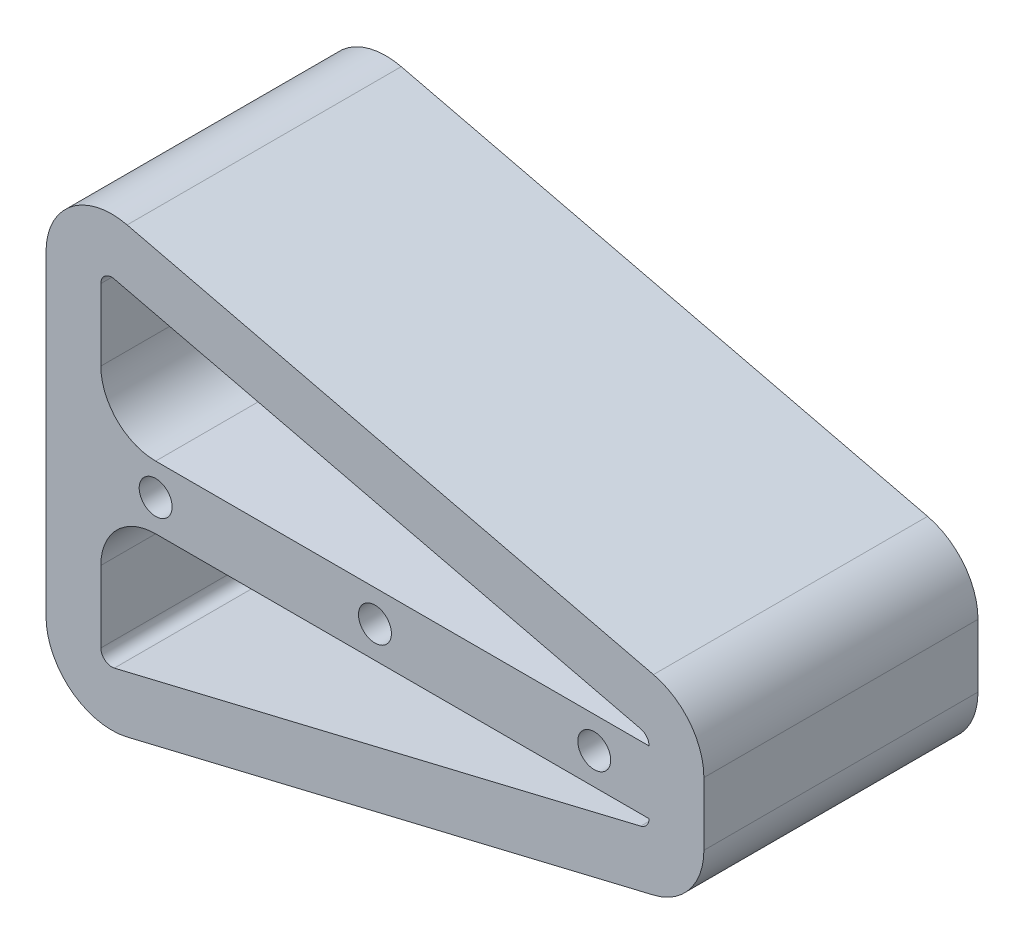
ISO-10303-21;
HEADER;
FILE_DESCRIPTION(('STEP AP214'),'2;1');
FILE_NAME('part.step','',(''),(''),'','','');
FILE_SCHEMA(('AUTOMOTIVE_DESIGN { 1 0 10303 214 1 1 1 1 }'));
ENDSEC;
DATA;
#1=APPLICATION_CONTEXT('core data for automotive mechanical design processes');
#2=APPLICATION_PROTOCOL_DEFINITION('international standard','automotive_design',2000,#1);
#3=PRODUCT_CONTEXT('',#1,'mechanical');
#4=PRODUCT('Part','Part','',(#3));
#5=PRODUCT_RELATED_PRODUCT_CATEGORY('part','',(#4));
#6=PRODUCT_DEFINITION_FORMATION('','',#4);
#7=PRODUCT_DEFINITION_CONTEXT('part definition',#1,'design');
#8=PRODUCT_DEFINITION('design','',#6,#7);
#9=PRODUCT_DEFINITION_SHAPE('','',#8);
#10=(LENGTH_UNIT() NAMED_UNIT(*) SI_UNIT(.MILLI.,.METRE.));
#11=(NAMED_UNIT(*) PLANE_ANGLE_UNIT() SI_UNIT($,.RADIAN.));
#12=(NAMED_UNIT(*) SI_UNIT($,.STERADIAN.) SOLID_ANGLE_UNIT());
#13=UNCERTAINTY_MEASURE_WITH_UNIT(LENGTH_MEASURE(1.E-05),#10,'distance_accuracy_value','');
#14=(GEOMETRIC_REPRESENTATION_CONTEXT(3) GLOBAL_UNCERTAINTY_ASSIGNED_CONTEXT((#13)) GLOBAL_UNIT_ASSIGNED_CONTEXT((#10,
#11,#12)) REPRESENTATION_CONTEXT('',''));
#15=CARTESIAN_POINT('',(0.,0.,0.));
#16=DIRECTION('',(0.,0.,1.));
#17=DIRECTION('',(1.,0.,0.));
#18=AXIS2_PLACEMENT_3D('',#15,#16,#17);
#19=CARTESIAN_POINT('',(6.27497028990107,-26.1504046756876,25.));
#20=DIRECTION('',(-0.233333333333333,0.972396809720988,0.));
#21=DIRECTION('',(-0.972396809720988,-0.233333333333333,0.));
#22=AXIS2_PLACEMENT_3D('',#19,#20,#21);
#23=PLANE('',#22);
#24=DIRECTION('',(0.972396809720988,0.233333333333333,0.));
#25=VECTOR('',#24,1.);
#26=CARTESIAN_POINT('',(6.27497028990107,-26.1504046756876,0.));
#27=LINE('',#26,#25);
#28=CARTESIAN_POINT('',(51.2333333333334,-15.3623348206002,0.));
#29=VERTEX_POINT('',#28);
#30=CARTESIAN_POINT('',(99.2333333333333,-3.84440316139039,0.));
#31=VERTEX_POINT('',#30);
#32=EDGE_CURVE('E291',#29,#31,#27,.T.);
#33=ORIENTED_EDGE('',*,*,#32,.F.);
#34=DIRECTION('',(0.,0.,-1.));
#35=VECTOR('',#34,1.);
#36=CARTESIAN_POINT('',(51.2333333333334,-15.3623348206002,25.));
#37=LINE('',#36,#35);
#38=CARTESIAN_POINT('',(51.2333333333334,-15.3623348206002,25.));
#39=VERTEX_POINT('',#38);
#40=EDGE_CURVE('E314',#39,#29,#37,.T.);
#41=ORIENTED_EDGE('',*,*,#40,.F.);
#42=DIRECTION('',(0.972396809720988,0.233333333333333,0.));
#43=VECTOR('',#42,1.);
#44=CARTESIAN_POINT('',(6.27497028990107,-26.1504046756876,25.));
#45=LINE('',#44,#43);
#46=CARTESIAN_POINT('',(99.2333333333333,-3.84440316139039,25.));
#47=VERTEX_POINT('',#46);
#48=EDGE_CURVE('E234',#39,#47,#45,.T.);
#49=ORIENTED_EDGE('',*,*,#48,.T.);
#50=DIRECTION('',(0.,0.,-1.));
#51=VECTOR('',#50,1.);
#52=CARTESIAN_POINT('',(99.2333333333333,-3.84440316139039,25.));
#53=LINE('',#52,#51);
#54=EDGE_CURVE('E305',#47,#31,#53,.T.);
#55=ORIENTED_EDGE('',*,*,#54,.T.);
#56=EDGE_LOOP('',(#33,#41,#49,#55));
#57=FACE_BOUND('',#56,.T.);
#58=ADVANCED_FACE('F39',(#57),#23,.T.);
#59=CARTESIAN_POINT('',(51.,-14.3899380108792,25.));
#60=DIRECTION('',(0.,0.,-1.));
#61=DIRECTION('',(-1.,0.,0.));
#62=AXIS2_PLACEMENT_3D('',#59,#60,#61);
#63=CYLINDRICAL_SURFACE('',#62,0.999999999999999);
#64=CARTESIAN_POINT('',(51.,-14.3899380108792,0.));
#65=DIRECTION('',(0.,0.,1.));
#66=DIRECTION('',(1.,0.,0.));
#67=AXIS2_PLACEMENT_3D('',#64,#65,#66);
#68=CIRCLE('',#67,0.999999999999999);
#69=CARTESIAN_POINT('',(50.,-14.3899380108792,0.));
#70=VERTEX_POINT('',#69);
#71=EDGE_CURVE('E294',#29,#70,#68,.F.);
#72=ORIENTED_EDGE('',*,*,#71,.T.);
#73=DIRECTION('',(0.,0.,-1.));
#74=VECTOR('',#73,1.);
#75=CARTESIAN_POINT('',(50.,-14.3899380108792,25.));
#76=LINE('',#75,#74);
#77=CARTESIAN_POINT('',(50.,-14.3899380108792,25.));
#78=VERTEX_POINT('',#77);
#79=EDGE_CURVE('E311',#78,#70,#76,.T.);
#80=ORIENTED_EDGE('',*,*,#79,.F.);
#81=CARTESIAN_POINT('',(51.,-14.3899380108792,25.));
#82=DIRECTION('',(0.,0.,1.));
#83=DIRECTION('',(1.,0.,0.));
#84=AXIS2_PLACEMENT_3D('',#81,#82,#83);
#85=CIRCLE('',#84,0.999999999999999);
#86=EDGE_CURVE('E237',#39,#78,#85,.F.);
#87=ORIENTED_EDGE('',*,*,#86,.F.);
#88=ORIENTED_EDGE('',*,*,#40,.T.);
#89=EDGE_LOOP('',(#72,#80,#87,#88));
#90=FACE_BOUND('',#89,.T.);
#91=ADVANCED_FACE('F372',(#90),#63,.F.);
#92=CARTESIAN_POINT('',(50.,0.,25.));
#93=DIRECTION('',(1.,0.,0.));
#94=DIRECTION('',(0.,0.,-1.));
#95=AXIS2_PLACEMENT_3D('',#92,#93,#94);
#96=PLANE('',#95);
#97=DIRECTION('',(0.,-1.,0.));
#98=VECTOR('',#97,1.);
#99=CARTESIAN_POINT('',(50.,0.,0.));
#100=LINE('',#99,#98);
#101=CARTESIAN_POINT('',(50.,-7.87200635166939,0.));
#102=VERTEX_POINT('',#101);
#103=EDGE_CURVE('E297',#102,#70,#100,.T.);
#104=ORIENTED_EDGE('',*,*,#103,.F.);
#105=DIRECTION('',(0.,0.,-1.));
#106=VECTOR('',#105,1.);
#107=CARTESIAN_POINT('',(50.,-7.87200635166939,25.));
#108=LINE('',#107,#106);
#109=CARTESIAN_POINT('',(50.,-7.87200635166939,25.));
#110=VERTEX_POINT('',#109);
#111=EDGE_CURVE('E340',#102,#110,#108,.F.);
#112=ORIENTED_EDGE('',*,*,#111,.T.);
#113=DIRECTION('',(0.,-1.,0.));
#114=VECTOR('',#113,1.);
#115=CARTESIAN_POINT('',(50.,0.,25.));
#116=LINE('',#115,#114);
#117=EDGE_CURVE('E240',#110,#78,#116,.T.);
#118=ORIENTED_EDGE('',*,*,#117,.T.);
#119=ORIENTED_EDGE('',*,*,#79,.T.);
#120=EDGE_LOOP('',(#104,#112,#118,#119));
#121=FACE_BOUND('',#120,.T.);
#122=ADVANCED_FACE('F368',(#121),#96,.T.);
#123=CARTESIAN_POINT('',(0.,-2.87200635166943,25.));
#124=DIRECTION('',(0.,1.,0.));
#125=DIRECTION('',(-1.,0.,0.));
#126=AXIS2_PLACEMENT_3D('',#123,#124,#125);
#127=PLANE('',#126);
#128=DIRECTION('',(1.,0.,0.));
#129=VECTOR('',#128,1.);
#130=CARTESIAN_POINT('',(0.,-2.87200635166943,25.));
#131=LINE('',#130,#129);
#132=CARTESIAN_POINT('',(55.,-2.87200635166939,25.));
#133=VERTEX_POINT('',#132);
#134=CARTESIAN_POINT('',(100.,-2.87200635166936,25.));
#135=VERTEX_POINT('',#134);
#136=EDGE_CURVE('E242',#133,#135,#131,.T.);
#137=ORIENTED_EDGE('',*,*,#136,.F.);
#138=DIRECTION('',(0.,0.,-1.));
#139=VECTOR('',#138,1.);
#140=CARTESIAN_POINT('',(55.,-2.87200635166939,25.));
#141=LINE('',#140,#139);
#142=CARTESIAN_POINT('',(55.,-2.87200635166939,0.));
#143=VERTEX_POINT('',#142);
#144=EDGE_CURVE('E316',#133,#143,#141,.T.);
#145=ORIENTED_EDGE('',*,*,#144,.T.);
#146=DIRECTION('',(1.,0.,0.));
#147=VECTOR('',#146,1.);
#148=CARTESIAN_POINT('',(0.,-2.87200635166943,0.));
#149=LINE('',#148,#147);
#150=CARTESIAN_POINT('',(100.,-2.87200635166936,0.));
#151=VERTEX_POINT('',#150);
#152=EDGE_CURVE('E299',#143,#151,#149,.T.);
#153=ORIENTED_EDGE('',*,*,#152,.T.);
#154=DIRECTION('',(0.,0.,-1.));
#155=VECTOR('',#154,1.);
#156=CARTESIAN_POINT('',(100.,-2.87200635166936,25.));
#157=LINE('',#156,#155);
#158=EDGE_CURVE('E307',#135,#151,#157,.T.);
#159=ORIENTED_EDGE('',*,*,#158,.F.);
#160=EDGE_LOOP('',(#137,#145,#153,#159));
#161=FACE_BOUND('',#160,.T.);
#162=ADVANCED_FACE('F360',(#161),#127,.F.);
#163=CARTESIAN_POINT('',(7.44163695656774,31.0123887242926,25.));
#164=DIRECTION('',(0.233333333333333,0.972396809720988,0.));
#165=DIRECTION('',(-0.972396809720988,0.233333333333333,0.));
#166=AXIS2_PLACEMENT_3D('',#163,#164,#165);
#167=PLANE('',#166);
#168=DIRECTION('',(0.972396809720988,-0.233333333333333,0.));
#169=VECTOR('',#168,1.);
#170=CARTESIAN_POINT('',(7.44163695656774,31.0123887242926,0.));
#171=LINE('',#170,#169);
#172=CARTESIAN_POINT('',(52.4000000000001,20.2243188692051,0.));
#173=VERTEX_POINT('',#172);
#174=CARTESIAN_POINT('',(100.4,8.70638720999534,0.));
#175=VERTEX_POINT('',#174);
#176=EDGE_CURVE('E267',#173,#175,#171,.T.);
#177=ORIENTED_EDGE('',*,*,#176,.F.);
#178=DIRECTION('',(0.,0.,-1.));
#179=VECTOR('',#178,1.);
#180=CARTESIAN_POINT('',(52.4000000000001,20.2243188692051,25.));
#181=LINE('',#180,#179);
#182=CARTESIAN_POINT('',(52.4000000000001,20.2243188692051,25.));
#183=VERTEX_POINT('',#182);
#184=EDGE_CURVE('E308',#183,#173,#181,.T.);
#185=ORIENTED_EDGE('',*,*,#184,.F.);
#186=DIRECTION('',(0.972396809720988,-0.233333333333333,0.));
#187=VECTOR('',#186,1.);
#188=CARTESIAN_POINT('',(7.44163695656774,31.0123887242926,25.));
#189=LINE('',#188,#187);
#190=CARTESIAN_POINT('',(100.4,8.70638720999534,25.));
#191=VERTEX_POINT('',#190);
#192=EDGE_CURVE('E212',#183,#191,#189,.T.);
#193=ORIENTED_EDGE('',*,*,#192,.T.);
#194=DIRECTION('',(0.,0.,-1.));
#195=VECTOR('',#194,1.);
#196=CARTESIAN_POINT('',(100.4,8.70638720999534,25.));
#197=LINE('',#196,#195);
#198=EDGE_CURVE('E185',#191,#175,#197,.T.);
#199=ORIENTED_EDGE('',*,*,#198,.T.);
#200=EDGE_LOOP('',(#177,#185,#193,#199));
#201=FACE_BOUND('',#200,.T.);
#202=ADVANCED_FACE('F429',(#201),#167,.T.);
#203=CARTESIAN_POINT('',(51.,14.3899380108792,25.));
#204=DIRECTION('',(0.,0.,-1.));
#205=DIRECTION('',(-1.,0.,0.));
#206=AXIS2_PLACEMENT_3D('',#203,#204,#205);
#207=CYLINDRICAL_SURFACE('',#206,6.);
#208=CARTESIAN_POINT('',(51.,14.3899380108792,0.));
#209=DIRECTION('',(0.,0.,1.));
#210=DIRECTION('',(1.,0.,0.));
#211=AXIS2_PLACEMENT_3D('',#208,#209,#210);
#212=CIRCLE('',#211,6.);
#213=CARTESIAN_POINT('',(45.,14.3899380108792,0.));
#214=VERTEX_POINT('',#213);
#215=EDGE_CURVE('E270',#173,#214,#212,.T.);
#216=ORIENTED_EDGE('',*,*,#215,.T.);
#217=DIRECTION('',(0.,0.,-1.));
#218=VECTOR('',#217,1.);
#219=CARTESIAN_POINT('',(45.,14.3899380108792,25.));
#220=LINE('',#219,#218);
#221=CARTESIAN_POINT('',(45.,14.3899380108792,25.));
#222=VERTEX_POINT('',#221);
#223=EDGE_CURVE('E329',#222,#214,#220,.T.);
#224=ORIENTED_EDGE('',*,*,#223,.F.);
#225=CARTESIAN_POINT('',(51.,14.3899380108792,25.));
#226=DIRECTION('',(0.,0.,1.));
#227=DIRECTION('',(1.,0.,0.));
#228=AXIS2_PLACEMENT_3D('',#225,#226,#227);
#229=CIRCLE('',#228,6.);
#230=EDGE_CURVE('E215',#183,#222,#229,.T.);
#231=ORIENTED_EDGE('',*,*,#230,.F.);
#232=ORIENTED_EDGE('',*,*,#184,.T.);
#233=EDGE_LOOP('',(#216,#224,#231,#232));
#234=FACE_BOUND('',#233,.T.);
#235=ADVANCED_FACE('F425',(#234),#207,.T.);
#236=CARTESIAN_POINT('',(45.,0.,25.));
#237=DIRECTION('',(1.,0.,0.));
#238=DIRECTION('',(0.,0.,-1.));
#239=AXIS2_PLACEMENT_3D('',#236,#237,#238);
#240=PLANE('',#239);
#241=DIRECTION('',(0.,-1.,0.));
#242=VECTOR('',#241,1.);
#243=CARTESIAN_POINT('',(45.,0.,0.));
#244=LINE('',#243,#242);
#245=CARTESIAN_POINT('',(45.,-14.3899380108792,0.));
#246=VERTEX_POINT('',#245);
#247=EDGE_CURVE('E273',#214,#246,#244,.T.);
#248=ORIENTED_EDGE('',*,*,#247,.T.);
#249=DIRECTION('',(0.,0.,-1.));
#250=VECTOR('',#249,1.);
#251=CARTESIAN_POINT('',(45.,-14.3899380108792,25.));
#252=LINE('',#251,#250);
#253=CARTESIAN_POINT('',(45.,-14.3899380108792,25.));
#254=VERTEX_POINT('',#253);
#255=EDGE_CURVE('E327',#254,#246,#252,.T.);
#256=ORIENTED_EDGE('',*,*,#255,.F.);
#257=DIRECTION('',(0.,-1.,0.));
#258=VECTOR('',#257,1.);
#259=CARTESIAN_POINT('',(45.,0.,25.));
#260=LINE('',#259,#258);
#261=EDGE_CURVE('E218',#222,#254,#260,.T.);
#262=ORIENTED_EDGE('',*,*,#261,.F.);
#263=ORIENTED_EDGE('',*,*,#223,.T.);
#264=EDGE_LOOP('',(#248,#256,#262,#263));
#265=FACE_BOUND('',#264,.T.);
#266=ADVANCED_FACE('F421',(#265),#240,.F.);
#267=CARTESIAN_POINT('',(51.,-14.3899380108792,25.));
#268=DIRECTION('',(0.,0.,-1.));
#269=DIRECTION('',(-1.,0.,0.));
#270=AXIS2_PLACEMENT_3D('',#267,#268,#269);
#271=CYLINDRICAL_SURFACE('',#270,6.);
#272=CARTESIAN_POINT('',(51.,-14.3899380108792,0.));
#273=DIRECTION('',(0.,0.,1.));
#274=DIRECTION('',(1.,0.,0.));
#275=AXIS2_PLACEMENT_3D('',#272,#273,#274);
#276=CIRCLE('',#275,6.);
#277=CARTESIAN_POINT('',(52.4000000000001,-20.2243188692051,0.));
#278=VERTEX_POINT('',#277);
#279=EDGE_CURVE('E276',#278,#246,#276,.F.);
#280=ORIENTED_EDGE('',*,*,#279,.F.);
#281=DIRECTION('',(0.,0.,-1.));
#282=VECTOR('',#281,1.);
#283=CARTESIAN_POINT('',(52.4000000000001,-20.2243188692051,25.));
#284=LINE('',#283,#282);
#285=CARTESIAN_POINT('',(52.4000000000001,-20.2243188692051,25.));
#286=VERTEX_POINT('',#285);
#287=EDGE_CURVE('E325',#286,#278,#284,.T.);
#288=ORIENTED_EDGE('',*,*,#287,.F.);
#289=CARTESIAN_POINT('',(51.,-14.3899380108792,25.));
#290=DIRECTION('',(0.,0.,1.));
#291=DIRECTION('',(1.,0.,0.));
#292=AXIS2_PLACEMENT_3D('',#289,#290,#291);
#293=CIRCLE('',#292,6.);
#294=EDGE_CURVE('E220',#286,#254,#293,.F.);
#295=ORIENTED_EDGE('',*,*,#294,.T.);
#296=ORIENTED_EDGE('',*,*,#255,.T.);
#297=EDGE_LOOP('',(#280,#288,#295,#296));
#298=FACE_BOUND('',#297,.T.);
#299=ADVANCED_FACE('F417',(#298),#271,.T.);
#300=CARTESIAN_POINT('',(7.44163695656774,-31.0123887242926,25.));
#301=DIRECTION('',(-0.233333333333333,0.972396809720988,0.));
#302=DIRECTION('',(-0.972396809720988,-0.233333333333333,0.));
#303=AXIS2_PLACEMENT_3D('',#300,#301,#302);
#304=PLANE('',#303);
#305=DIRECTION('',(0.972396809720988,0.233333333333333,0.));
#306=VECTOR('',#305,1.);
#307=CARTESIAN_POINT('',(7.44163695656774,-31.0123887242926,0.));
#308=LINE('',#307,#306);
#309=CARTESIAN_POINT('',(100.4,-8.70638720999534,0.));
#310=VERTEX_POINT('',#309);
#311=EDGE_CURVE('E279',#278,#310,#308,.T.);
#312=ORIENTED_EDGE('',*,*,#311,.T.);
#313=DIRECTION('',(0.,0.,-1.));
#314=VECTOR('',#313,1.);
#315=CARTESIAN_POINT('',(100.4,-8.70638720999534,25.));
#316=LINE('',#315,#314);
#317=CARTESIAN_POINT('',(100.4,-8.70638720999534,25.));
#318=VERTEX_POINT('',#317);
#319=EDGE_CURVE('E322',#318,#310,#316,.T.);
#320=ORIENTED_EDGE('',*,*,#319,.F.);
#321=DIRECTION('',(0.972396809720988,0.233333333333333,0.));
#322=VECTOR('',#321,1.);
#323=CARTESIAN_POINT('',(7.44163695656774,-31.0123887242926,25.));
#324=LINE('',#323,#322);
#325=EDGE_CURVE('E223',#286,#318,#324,.T.);
#326=ORIENTED_EDGE('',*,*,#325,.F.);
#327=ORIENTED_EDGE('',*,*,#287,.T.);
#328=EDGE_LOOP('',(#312,#320,#326,#327));
#329=FACE_BOUND('',#328,.T.);
#330=ADVANCED_FACE('F413',(#329),#304,.F.);
#331=CARTESIAN_POINT('',(99.,-2.8720063516694,25.));
#332=DIRECTION('',(0.,0.,-1.));
#333=DIRECTION('',(-1.,0.,0.));
#334=AXIS2_PLACEMENT_3D('',#331,#332,#333);
#335=CYLINDRICAL_SURFACE('',#334,6.);
#336=CARTESIAN_POINT('',(99.,-2.8720063516694,0.));
#337=DIRECTION('',(0.,0.,1.));
#338=DIRECTION('',(1.,0.,0.));
#339=AXIS2_PLACEMENT_3D('',#336,#337,#338);
#340=CIRCLE('',#339,6.);
#341=CARTESIAN_POINT('',(105.,-2.87200635166936,0.));
#342=VERTEX_POINT('',#341);
#343=EDGE_CURVE('E282',#310,#342,#340,.T.);
#344=ORIENTED_EDGE('',*,*,#343,.T.);
#345=DIRECTION('',(0.,0.,-1.));
#346=VECTOR('',#345,1.);
#347=CARTESIAN_POINT('',(105.,-2.87200635166936,25.));
#348=LINE('',#347,#346);
#349=CARTESIAN_POINT('',(105.,-2.87200635166936,25.));
#350=VERTEX_POINT('',#349);
#351=EDGE_CURVE('E320',#350,#342,#348,.T.);
#352=ORIENTED_EDGE('',*,*,#351,.F.);
#353=CARTESIAN_POINT('',(99.,-2.8720063516694,25.));
#354=DIRECTION('',(0.,0.,1.));
#355=DIRECTION('',(1.,0.,0.));
#356=AXIS2_PLACEMENT_3D('',#353,#354,#355);
#357=CIRCLE('',#356,6.);
#358=EDGE_CURVE('E226',#318,#350,#357,.T.);
#359=ORIENTED_EDGE('',*,*,#358,.F.);
#360=ORIENTED_EDGE('',*,*,#319,.T.);
#361=EDGE_LOOP('',(#344,#352,#359,#360));
#362=FACE_BOUND('',#361,.T.);
#363=ADVANCED_FACE('F409',(#362),#335,.T.);
#364=CARTESIAN_POINT('',(105.,0.,25.));
#365=DIRECTION('',(1.,0.,0.));
#366=DIRECTION('',(0.,0.,-1.));
#367=AXIS2_PLACEMENT_3D('',#364,#365,#366);
#368=PLANE('',#367);
#369=DIRECTION('',(0.,-1.,0.));
#370=VECTOR('',#369,1.);
#371=CARTESIAN_POINT('',(105.,0.,0.));
#372=LINE('',#371,#370);
#373=CARTESIAN_POINT('',(105.,2.87200635166936,0.));
#374=VERTEX_POINT('',#373);
#375=EDGE_CURVE('E285',#374,#342,#372,.T.);
#376=ORIENTED_EDGE('',*,*,#375,.F.);
#377=DIRECTION('',(0.,0.,-1.));
#378=VECTOR('',#377,1.);
#379=CARTESIAN_POINT('',(105.,2.87200635166936,25.));
#380=LINE('',#379,#378);
#381=CARTESIAN_POINT('',(105.,2.87200635166936,25.));
#382=VERTEX_POINT('',#381);
#383=EDGE_CURVE('E318',#382,#374,#380,.T.);
#384=ORIENTED_EDGE('',*,*,#383,.F.);
#385=DIRECTION('',(0.,-1.,0.));
#386=VECTOR('',#385,1.);
#387=CARTESIAN_POINT('',(105.,0.,25.));
#388=LINE('',#387,#386);
#389=EDGE_CURVE('E228',#382,#350,#388,.T.);
#390=ORIENTED_EDGE('',*,*,#389,.T.);
#391=ORIENTED_EDGE('',*,*,#351,.T.);
#392=EDGE_LOOP('',(#376,#384,#390,#391));
#393=FACE_BOUND('',#392,.T.);
#394=ADVANCED_FACE('F406',(#393),#368,.T.);
#395=CARTESIAN_POINT('',(51.,14.3899380108792,25.));
#396=DIRECTION('',(0.,0.,-1.));
#397=DIRECTION('',(-1.,0.,0.));
#398=AXIS2_PLACEMENT_3D('',#395,#396,#397);
#399=CYLINDRICAL_SURFACE('',#398,1.);
#400=CARTESIAN_POINT('',(51.,14.3899380108792,0.));
#401=DIRECTION('',(0.,0.,1.));
#402=DIRECTION('',(1.,0.,0.));
#403=AXIS2_PLACEMENT_3D('',#400,#401,#402);
#404=CIRCLE('',#403,1.);
#405=CARTESIAN_POINT('',(51.2333333333334,15.3623348206002,0.));
#406=VERTEX_POINT('',#405);
#407=CARTESIAN_POINT('',(50.,14.3899380108792,0.));
#408=VERTEX_POINT('',#407);
#409=EDGE_CURVE('E181',#406,#408,#404,.T.);
#410=ORIENTED_EDGE('',*,*,#409,.F.);
#411=DIRECTION('',(0.,0.,-1.));
#412=VECTOR('',#411,1.);
#413=CARTESIAN_POINT('',(51.2333333333334,15.3623348206002,25.));
#414=LINE('',#413,#412);
#415=CARTESIAN_POINT('',(51.2333333333334,15.3623348206002,25.));
#416=VERTEX_POINT('',#415);
#417=EDGE_CURVE('E174',#416,#406,#414,.T.);
#418=ORIENTED_EDGE('',*,*,#417,.F.);
#419=CARTESIAN_POINT('',(51.,14.3899380108792,25.));
#420=DIRECTION('',(0.,0.,1.));
#421=DIRECTION('',(1.,0.,0.));
#422=AXIS2_PLACEMENT_3D('',#419,#420,#421);
#423=CIRCLE('',#422,1.);
#424=CARTESIAN_POINT('',(50.,14.3899380108792,25.));
#425=VERTEX_POINT('',#424);
#426=EDGE_CURVE('E178',#416,#425,#423,.T.);
#427=ORIENTED_EDGE('',*,*,#426,.T.);
#428=DIRECTION('',(0.,0.,-1.));
#429=VECTOR('',#428,1.);
#430=CARTESIAN_POINT('',(50.,14.3899380108792,25.));
#431=LINE('',#430,#429);
#432=EDGE_CURVE('E247',#425,#408,#431,.T.);
#433=ORIENTED_EDGE('',*,*,#432,.T.);
#434=EDGE_LOOP('',(#410,#418,#427,#433));
#435=FACE_BOUND('',#434,.T.);
#436=ADVANCED_FACE('F176',(#435),#399,.F.);
#437=CARTESIAN_POINT('',(6.27497028990107,26.1504046756877,25.));
#438=DIRECTION('',(0.233333333333333,0.972396809720988,0.));
#439=DIRECTION('',(-0.972396809720988,0.233333333333333,0.));
#440=AXIS2_PLACEMENT_3D('',#437,#438,#439);
#441=PLANE('',#440);
#442=DIRECTION('',(0.972396809720988,-0.233333333333333,0.));
#443=VECTOR('',#442,1.);
#444=CARTESIAN_POINT('',(6.27497028990107,26.1504046756877,0.));
#445=LINE('',#444,#443);
#446=CARTESIAN_POINT('',(99.2333333333333,3.84440316139039,0.));
#447=VERTEX_POINT('',#446);
#448=EDGE_CURVE('E258',#406,#447,#445,.T.);
#449=ORIENTED_EDGE('',*,*,#448,.T.);
#450=DIRECTION('',(0.,0.,-1.));
#451=VECTOR('',#450,1.);
#452=CARTESIAN_POINT('',(99.2333333333333,3.84440316139039,25.));
#453=LINE('',#452,#451);
#454=CARTESIAN_POINT('',(99.2333333333333,3.84440316139039,25.));
#455=VERTEX_POINT('',#454);
#456=EDGE_CURVE('E186',#455,#447,#453,.T.);
#457=ORIENTED_EDGE('',*,*,#456,.F.);
#458=DIRECTION('',(0.972396809720988,-0.233333333333333,0.));
#459=VECTOR('',#458,1.);
#460=CARTESIAN_POINT('',(6.27497028990107,26.1504046756877,25.));
#461=LINE('',#460,#459);
#462=EDGE_CURVE('E190',#416,#455,#461,.T.);
#463=ORIENTED_EDGE('',*,*,#462,.F.);
#464=ORIENTED_EDGE('',*,*,#417,.T.);
#465=EDGE_LOOP('',(#449,#457,#463,#464));
#466=FACE_BOUND('',#465,.T.);
#467=ADVANCED_FACE('F191',(#466),#441,.F.);
#468=CARTESIAN_POINT('',(99.,2.8720063516694,25.));
#469=DIRECTION('',(0.,0.,-1.));
#470=DIRECTION('',(-1.,0.,0.));
#471=AXIS2_PLACEMENT_3D('',#468,#469,#470);
#472=CYLINDRICAL_SURFACE('',#471,1.);
#473=CARTESIAN_POINT('',(99.,2.8720063516694,0.));
#474=DIRECTION('',(0.,0.,1.));
#475=DIRECTION('',(1.,0.,0.));
#476=AXIS2_PLACEMENT_3D('',#473,#474,#475);
#477=CIRCLE('',#476,1.);
#478=CARTESIAN_POINT('',(100.,2.87200635166939,0.));
#479=VERTEX_POINT('',#478);
#480=EDGE_CURVE('E260',#447,#479,#477,.F.);
#481=ORIENTED_EDGE('',*,*,#480,.T.);
#482=DIRECTION('',(0.,0.,-1.));
#483=VECTOR('',#482,1.);
#484=CARTESIAN_POINT('',(100.,2.87200635166939,25.));
#485=LINE('',#484,#483);
#486=CARTESIAN_POINT('',(100.,2.87200635166939,25.));
#487=VERTEX_POINT('',#486);
#488=EDGE_CURVE('E334',#487,#479,#485,.T.);
#489=ORIENTED_EDGE('',*,*,#488,.F.);
#490=CARTESIAN_POINT('',(99.,2.8720063516694,25.));
#491=DIRECTION('',(0.,0.,1.));
#492=DIRECTION('',(1.,0.,0.));
#493=AXIS2_PLACEMENT_3D('',#490,#491,#492);
#494=CIRCLE('',#493,1.);
#495=EDGE_CURVE('E195',#455,#487,#494,.F.);
#496=ORIENTED_EDGE('',*,*,#495,.F.);
#497=ORIENTED_EDGE('',*,*,#456,.T.);
#498=EDGE_LOOP('',(#481,#489,#496,#497));
#499=FACE_BOUND('',#498,.T.);
#500=ADVANCED_FACE('F440',(#499),#472,.F.);
#501=CARTESIAN_POINT('',(0.,2.8720063516694,25.));
#502=DIRECTION('',(0.,1.,0.));
#503=DIRECTION('',(-1.,0.,0.));
#504=AXIS2_PLACEMENT_3D('',#501,#502,#503);
#505=PLANE('',#504);
#506=DIRECTION('',(1.,0.,0.));
#507=VECTOR('',#506,1.);
#508=CARTESIAN_POINT('',(0.,2.8720063516694,0.));
#509=LINE('',#508,#507);
#510=CARTESIAN_POINT('',(55.,2.8720063516694,0.));
#511=VERTEX_POINT('',#510);
#512=EDGE_CURVE('E263',#511,#479,#509,.T.);
#513=ORIENTED_EDGE('',*,*,#512,.F.);
#514=DIRECTION('',(0.,0.,-1.));
#515=VECTOR('',#514,1.);
#516=CARTESIAN_POINT('',(55.,2.8720063516694,25.));
#517=LINE('',#516,#515);
#518=CARTESIAN_POINT('',(55.,2.8720063516694,25.));
#519=VERTEX_POINT('',#518);
#520=EDGE_CURVE('E54',#511,#519,#517,.F.);
#521=ORIENTED_EDGE('',*,*,#520,.T.);
#522=DIRECTION('',(1.,0.,0.));
#523=VECTOR('',#522,1.);
#524=CARTESIAN_POINT('',(0.,2.8720063516694,25.));
#525=LINE('',#524,#523);
#526=EDGE_CURVE('E209',#519,#487,#525,.T.);
#527=ORIENTED_EDGE('',*,*,#526,.T.);
#528=ORIENTED_EDGE('',*,*,#488,.T.);
#529=EDGE_LOOP('',(#513,#521,#527,#528));
#530=FACE_BOUND('',#529,.T.);
#531=ADVANCED_FACE('F404',(#530),#505,.T.);
#532=CARTESIAN_POINT('',(99.,2.8720063516694,25.));
#533=DIRECTION('',(0.,0.,-1.));
#534=DIRECTION('',(-1.,0.,0.));
#535=AXIS2_PLACEMENT_3D('',#532,#533,#534);
#536=CYLINDRICAL_SURFACE('',#535,6.);
#537=CARTESIAN_POINT('',(99.,2.8720063516694,0.));
#538=DIRECTION('',(0.,0.,1.));
#539=DIRECTION('',(1.,0.,0.));
#540=AXIS2_PLACEMENT_3D('',#537,#538,#539);
#541=CIRCLE('',#540,6.);
#542=EDGE_CURVE('E288',#175,#374,#541,.F.);
#543=ORIENTED_EDGE('',*,*,#542,.F.);
#544=ORIENTED_EDGE('',*,*,#198,.F.);
#545=CARTESIAN_POINT('',(99.,2.8720063516694,25.));
#546=DIRECTION('',(0.,0.,1.));
#547=DIRECTION('',(1.,0.,0.));
#548=AXIS2_PLACEMENT_3D('',#545,#546,#547);
#549=CIRCLE('',#548,6.);
#550=EDGE_CURVE('E231',#191,#382,#549,.F.);
#551=ORIENTED_EDGE('',*,*,#550,.T.);
#552=ORIENTED_EDGE('',*,*,#383,.T.);
#553=EDGE_LOOP('',(#543,#544,#551,#552));
#554=FACE_BOUND('',#553,.T.);
#555=ADVANCED_FACE('F400',(#554),#536,.T.);
#556=CARTESIAN_POINT('',(50.,0.,25.));
#557=DIRECTION('',(1.,0.,0.));
#558=DIRECTION('',(0.,0.,-1.));
#559=AXIS2_PLACEMENT_3D('',#556,#557,#558);
#560=PLANE('',#559);
#561=DIRECTION('',(0.,-1.,0.));
#562=VECTOR('',#561,1.);
#563=CARTESIAN_POINT('',(50.,0.,25.));
#564=LINE('',#563,#562);
#565=CARTESIAN_POINT('',(50.,7.8720063516694,25.));
#566=VERTEX_POINT('',#565);
#567=EDGE_CURVE('E200',#425,#566,#564,.T.);
#568=ORIENTED_EDGE('',*,*,#567,.T.);
#569=DIRECTION('',(0.,0.,-1.));
#570=VECTOR('',#569,1.);
#571=CARTESIAN_POINT('',(50.,7.8720063516694,0.));
#572=LINE('',#571,#570);
#573=CARTESIAN_POINT('',(50.,7.8720063516694,0.));
#574=VERTEX_POINT('',#573);
#575=EDGE_CURVE('E342',#566,#574,#572,.T.);
#576=ORIENTED_EDGE('',*,*,#575,.T.);
#577=DIRECTION('',(0.,-1.,0.));
#578=VECTOR('',#577,1.);
#579=CARTESIAN_POINT('',(50.,0.,0.));
#580=LINE('',#579,#578);
#581=EDGE_CURVE('E265',#408,#574,#580,.T.);
#582=ORIENTED_EDGE('',*,*,#581,.F.);
#583=ORIENTED_EDGE('',*,*,#432,.F.);
#584=EDGE_LOOP('',(#568,#576,#582,#583));
#585=FACE_BOUND('',#584,.T.);
#586=ADVANCED_FACE('F403',(#585),#560,.T.);
#587=CARTESIAN_POINT('',(75.,0.,25.));
#588=DIRECTION('',(0.,0.,-1.));
#589=DIRECTION('',(-1.,0.,0.));
#590=AXIS2_PLACEMENT_3D('',#587,#588,#589);
#591=CYLINDRICAL_SURFACE('',#590,1.5);
#592=CARTESIAN_POINT('',(75.,0.,25.));
#593=DIRECTION('',(0.,0.,1.));
#594=DIRECTION('',(1.,0.,0.));
#595=AXIS2_PLACEMENT_3D('',#592,#593,#594);
#596=CIRCLE('',#595,1.5);
#597=CARTESIAN_POINT('',(76.5,0.,25.));
#598=VERTEX_POINT('',#597);
#599=EDGE_CURVE('E201',#598,#598,#596,.T.);
#600=ORIENTED_EDGE('',*,*,#599,.T.);
#601=EDGE_LOOP('',(#600));
#602=FACE_BOUND('',#601,.T.);
#603=CARTESIAN_POINT('',(75.,0.,0.));
#604=DIRECTION('',(0.,0.,1.));
#605=DIRECTION('',(1.,0.,0.));
#606=AXIS2_PLACEMENT_3D('',#603,#604,#605);
#607=CIRCLE('',#606,1.5);
#608=CARTESIAN_POINT('',(76.5,0.,0.));
#609=VERTEX_POINT('',#608);
#610=EDGE_CURVE('E254',#609,#609,#607,.T.);
#611=ORIENTED_EDGE('',*,*,#610,.F.);
#612=EDGE_LOOP('',(#611));
#613=FACE_BOUND('',#612,.T.);
#614=ADVANCED_FACE('F436',(#602,#613),#591,.F.);
#615=CARTESIAN_POINT('',(95.,0.,25.));
#616=DIRECTION('',(0.,0.,-1.));
#617=DIRECTION('',(-1.,0.,0.));
#618=AXIS2_PLACEMENT_3D('',#615,#616,#617);
#619=CYLINDRICAL_SURFACE('',#618,1.5);
#620=CARTESIAN_POINT('',(95.,0.,25.));
#621=DIRECTION('',(0.,0.,1.));
#622=DIRECTION('',(1.,0.,0.));
#623=AXIS2_PLACEMENT_3D('',#620,#621,#622);
#624=CIRCLE('',#623,1.5);
#625=CARTESIAN_POINT('',(96.5,0.,25.));
#626=VERTEX_POINT('',#625);
#627=EDGE_CURVE('E204',#626,#626,#624,.T.);
#628=ORIENTED_EDGE('',*,*,#627,.T.);
#629=EDGE_LOOP('',(#628));
#630=FACE_BOUND('',#629,.T.);
#631=CARTESIAN_POINT('',(95.,0.,0.));
#632=DIRECTION('',(0.,0.,1.));
#633=DIRECTION('',(1.,0.,0.));
#634=AXIS2_PLACEMENT_3D('',#631,#632,#633);
#635=CIRCLE('',#634,1.5);
#636=CARTESIAN_POINT('',(96.5,0.,0.));
#637=VERTEX_POINT('',#636);
#638=EDGE_CURVE('E251',#637,#637,#635,.T.);
#639=ORIENTED_EDGE('',*,*,#638,.F.);
#640=EDGE_LOOP('',(#639));
#641=FACE_BOUND('',#640,.T.);
#642=ADVANCED_FACE('F387',(#630,#641),#619,.F.);
#643=CARTESIAN_POINT('',(55.,0.,25.));
#644=DIRECTION('',(0.,0.,-1.));
#645=DIRECTION('',(-1.,0.,0.));
#646=AXIS2_PLACEMENT_3D('',#643,#644,#645);
#647=CYLINDRICAL_SURFACE('',#646,1.5);
#648=CARTESIAN_POINT('',(55.,0.,25.));
#649=DIRECTION('',(0.,0.,1.));
#650=DIRECTION('',(1.,0.,0.));
#651=AXIS2_PLACEMENT_3D('',#648,#649,#650);
#652=CIRCLE('',#651,1.5);
#653=CARTESIAN_POINT('',(56.5,0.,25.));
#654=VERTEX_POINT('',#653);
#655=EDGE_CURVE('E304',#654,#654,#652,.T.);
#656=ORIENTED_EDGE('',*,*,#655,.T.);
#657=EDGE_LOOP('',(#656));
#658=FACE_BOUND('',#657,.T.);
#659=CARTESIAN_POINT('',(55.,0.,0.));
#660=DIRECTION('',(0.,0.,1.));
#661=DIRECTION('',(1.,0.,0.));
#662=AXIS2_PLACEMENT_3D('',#659,#660,#661);
#663=CIRCLE('',#662,1.5);
#664=CARTESIAN_POINT('',(56.5,0.,0.));
#665=VERTEX_POINT('',#664);
#666=EDGE_CURVE('E248',#665,#665,#663,.T.);
#667=ORIENTED_EDGE('',*,*,#666,.F.);
#668=EDGE_LOOP('',(#667));
#669=FACE_BOUND('',#668,.T.);
#670=ADVANCED_FACE('F379',(#658,#669),#647,.F.);
#671=CARTESIAN_POINT('',(99.,-2.8720063516694,25.));
#672=DIRECTION('',(0.,0.,-1.));
#673=DIRECTION('',(-1.,0.,0.));
#674=AXIS2_PLACEMENT_3D('',#671,#672,#673);
#675=CYLINDRICAL_SURFACE('',#674,1.);
#676=CARTESIAN_POINT('',(99.,-2.8720063516694,0.));
#677=DIRECTION('',(0.,0.,1.));
#678=DIRECTION('',(1.,0.,0.));
#679=AXIS2_PLACEMENT_3D('',#676,#677,#678);
#680=CIRCLE('',#679,1.);
#681=EDGE_CURVE('E301',#31,#151,#680,.T.);
#682=ORIENTED_EDGE('',*,*,#681,.F.);
#683=ORIENTED_EDGE('',*,*,#54,.F.);
#684=CARTESIAN_POINT('',(99.,-2.8720063516694,25.));
#685=DIRECTION('',(0.,0.,1.));
#686=DIRECTION('',(1.,0.,0.));
#687=AXIS2_PLACEMENT_3D('',#684,#685,#686);
#688=CIRCLE('',#687,1.);
#689=EDGE_CURVE('E244',#47,#135,#688,.T.);
#690=ORIENTED_EDGE('',*,*,#689,.T.);
#691=ORIENTED_EDGE('',*,*,#158,.T.);
#692=EDGE_LOOP('',(#682,#683,#690,#691));
#693=FACE_BOUND('',#692,.T.);
#694=ADVANCED_FACE('F377',(#693),#675,.F.);
#695=CARTESIAN_POINT('',(0.,0.,25.));
#696=DIRECTION('',(0.,0.,1.));
#697=DIRECTION('',(1.,0.,0.));
#698=AXIS2_PLACEMENT_3D('',#695,#696,#697);
#699=PLANE('',#698);
#700=ORIENTED_EDGE('',*,*,#655,.F.);
#701=EDGE_LOOP('',(#700));
#702=FACE_BOUND('',#701,.T.);
#703=ORIENTED_EDGE('',*,*,#627,.F.);
#704=EDGE_LOOP('',(#703));
#705=FACE_BOUND('',#704,.T.);
#706=ORIENTED_EDGE('',*,*,#599,.F.);
#707=EDGE_LOOP('',(#706));
#708=FACE_BOUND('',#707,.T.);
#709=ORIENTED_EDGE('',*,*,#426,.F.);
#710=ORIENTED_EDGE('',*,*,#462,.T.);
#711=ORIENTED_EDGE('',*,*,#495,.T.);
#712=ORIENTED_EDGE('',*,*,#526,.F.);
#713=CARTESIAN_POINT('',(55.,7.8720063516694,25.));
#714=DIRECTION('',(0.,0.,1.));
#715=DIRECTION('',(1.,0.,0.));
#716=AXIS2_PLACEMENT_3D('',#713,#714,#715);
#717=CIRCLE('',#716,5.);
#718=EDGE_CURVE('E11',#519,#566,#717,.F.);
#719=ORIENTED_EDGE('',*,*,#718,.T.);
#720=ORIENTED_EDGE('',*,*,#567,.F.);
#721=EDGE_LOOP('',(#709,#710,#711,#712,#719,#720));
#722=FACE_BOUND('',#721,.T.);
#723=ORIENTED_EDGE('',*,*,#192,.F.);
#724=ORIENTED_EDGE('',*,*,#230,.T.);
#725=ORIENTED_EDGE('',*,*,#261,.T.);
#726=ORIENTED_EDGE('',*,*,#294,.F.);
#727=ORIENTED_EDGE('',*,*,#325,.T.);
#728=ORIENTED_EDGE('',*,*,#358,.T.);
#729=ORIENTED_EDGE('',*,*,#389,.F.);
#730=ORIENTED_EDGE('',*,*,#550,.F.);
#731=EDGE_LOOP('',(#723,#724,#725,#726,#727,#728,#729,#730));
#732=FACE_BOUND('',#731,.T.);
#733=ORIENTED_EDGE('',*,*,#48,.F.);
#734=ORIENTED_EDGE('',*,*,#86,.T.);
#735=ORIENTED_EDGE('',*,*,#117,.F.);
#736=CARTESIAN_POINT('',(55.,-7.87200635166939,25.));
#737=DIRECTION('',(0.,0.,1.));
#738=DIRECTION('',(1.,0.,0.));
#739=AXIS2_PLACEMENT_3D('',#736,#737,#738);
#740=CIRCLE('',#739,5.);
#741=EDGE_CURVE('E348',#110,#133,#740,.F.);
#742=ORIENTED_EDGE('',*,*,#741,.T.);
#743=ORIENTED_EDGE('',*,*,#136,.T.);
#744=ORIENTED_EDGE('',*,*,#689,.F.);
#745=EDGE_LOOP('',(#733,#734,#735,#742,#743,#744));
#746=FACE_BOUND('',#745,.T.);
#747=ADVANCED_FACE('F197',(#702,#705,#708,#722,#732,#746),#699,.T.);
#748=CARTESIAN_POINT('',(0.,0.,0.));
#749=DIRECTION('',(0.,0.,1.));
#750=DIRECTION('',(1.,0.,0.));
#751=AXIS2_PLACEMENT_3D('',#748,#749,#750);
#752=PLANE('',#751);
#753=ORIENTED_EDGE('',*,*,#666,.T.);
#754=EDGE_LOOP('',(#753));
#755=FACE_BOUND('',#754,.T.);
#756=ORIENTED_EDGE('',*,*,#638,.T.);
#757=EDGE_LOOP('',(#756));
#758=FACE_BOUND('',#757,.T.);
#759=ORIENTED_EDGE('',*,*,#610,.T.);
#760=EDGE_LOOP('',(#759));
#761=FACE_BOUND('',#760,.T.);
#762=ORIENTED_EDGE('',*,*,#409,.T.);
#763=ORIENTED_EDGE('',*,*,#581,.T.);
#764=CARTESIAN_POINT('',(55.,7.8720063516694,0.));
#765=DIRECTION('',(0.,0.,1.));
#766=DIRECTION('',(1.,0.,0.));
#767=AXIS2_PLACEMENT_3D('',#764,#765,#766);
#768=CIRCLE('',#767,5.);
#769=EDGE_CURVE('E47',#574,#511,#768,.T.);
#770=ORIENTED_EDGE('',*,*,#769,.T.);
#771=ORIENTED_EDGE('',*,*,#512,.T.);
#772=ORIENTED_EDGE('',*,*,#480,.F.);
#773=ORIENTED_EDGE('',*,*,#448,.F.);
#774=EDGE_LOOP('',(#762,#763,#770,#771,#772,#773));
#775=FACE_BOUND('',#774,.T.);
#776=ORIENTED_EDGE('',*,*,#176,.T.);
#777=ORIENTED_EDGE('',*,*,#542,.T.);
#778=ORIENTED_EDGE('',*,*,#375,.T.);
#779=ORIENTED_EDGE('',*,*,#343,.F.);
#780=ORIENTED_EDGE('',*,*,#311,.F.);
#781=ORIENTED_EDGE('',*,*,#279,.T.);
#782=ORIENTED_EDGE('',*,*,#247,.F.);
#783=ORIENTED_EDGE('',*,*,#215,.F.);
#784=EDGE_LOOP('',(#776,#777,#778,#779,#780,#781,#782,#783));
#785=FACE_BOUND('',#784,.T.);
#786=ORIENTED_EDGE('',*,*,#32,.T.);
#787=ORIENTED_EDGE('',*,*,#681,.T.);
#788=ORIENTED_EDGE('',*,*,#152,.F.);
#789=CARTESIAN_POINT('',(55.,-7.87200635166939,0.));
#790=DIRECTION('',(0.,0.,1.));
#791=DIRECTION('',(1.,0.,0.));
#792=AXIS2_PLACEMENT_3D('',#789,#790,#791);
#793=CIRCLE('',#792,5.);
#794=EDGE_CURVE('E346',#143,#102,#793,.T.);
#795=ORIENTED_EDGE('',*,*,#794,.T.);
#796=ORIENTED_EDGE('',*,*,#103,.T.);
#797=ORIENTED_EDGE('',*,*,#71,.F.);
#798=EDGE_LOOP('',(#786,#787,#788,#795,#796,#797));
#799=FACE_BOUND('',#798,.T.);
#800=ADVANCED_FACE('F365',(#755,#758,#761,#775,#785,#799),#752,.F.);
#801=CARTESIAN_POINT('',(55.,-7.87200635166939,25.));
#802=DIRECTION('',(0.,0.,-1.));
#803=DIRECTION('',(-1.,0.,0.));
#804=AXIS2_PLACEMENT_3D('',#801,#802,#803);
#805=CYLINDRICAL_SURFACE('',#804,5.);
#806=ORIENTED_EDGE('',*,*,#741,.F.);
#807=ORIENTED_EDGE('',*,*,#111,.F.);
#808=ORIENTED_EDGE('',*,*,#794,.F.);
#809=ORIENTED_EDGE('',*,*,#144,.F.);
#810=EDGE_LOOP('',(#806,#807,#808,#809));
#811=FACE_BOUND('',#810,.T.);
#812=ADVANCED_FACE('F362',(#811),#805,.F.);
#813=CARTESIAN_POINT('',(55.,7.8720063516694,25.));
#814=DIRECTION('',(0.,0.,1.));
#815=DIRECTION('',(1.,0.,0.));
#816=AXIS2_PLACEMENT_3D('',#813,#814,#815);
#817=CYLINDRICAL_SURFACE('',#816,5.);
#818=ORIENTED_EDGE('',*,*,#718,.F.);
#819=ORIENTED_EDGE('',*,*,#520,.F.);
#820=ORIENTED_EDGE('',*,*,#769,.F.);
#821=ORIENTED_EDGE('',*,*,#575,.F.);
#822=EDGE_LOOP('',(#818,#819,#820,#821));
#823=FACE_BOUND('',#822,.T.);
#824=ADVANCED_FACE('F41',(#823),#817,.F.);
#825=CLOSED_SHELL('',(#58,#91,#122,#162,#202,#235,#266,#299,#330,#363,#394,#436,#467,#500,#531,
#555,#586,#614,#642,#670,#694,#747,#800,#812,#824));
#826=MANIFOLD_SOLID_BREP('B2',#825);
#827=ADVANCED_BREP_SHAPE_REPRESENTATION('',(#18,#826),#14);
#828=SHAPE_DEFINITION_REPRESENTATION(#9,#827);
ENDSEC;
END-ISO-10303-21;
